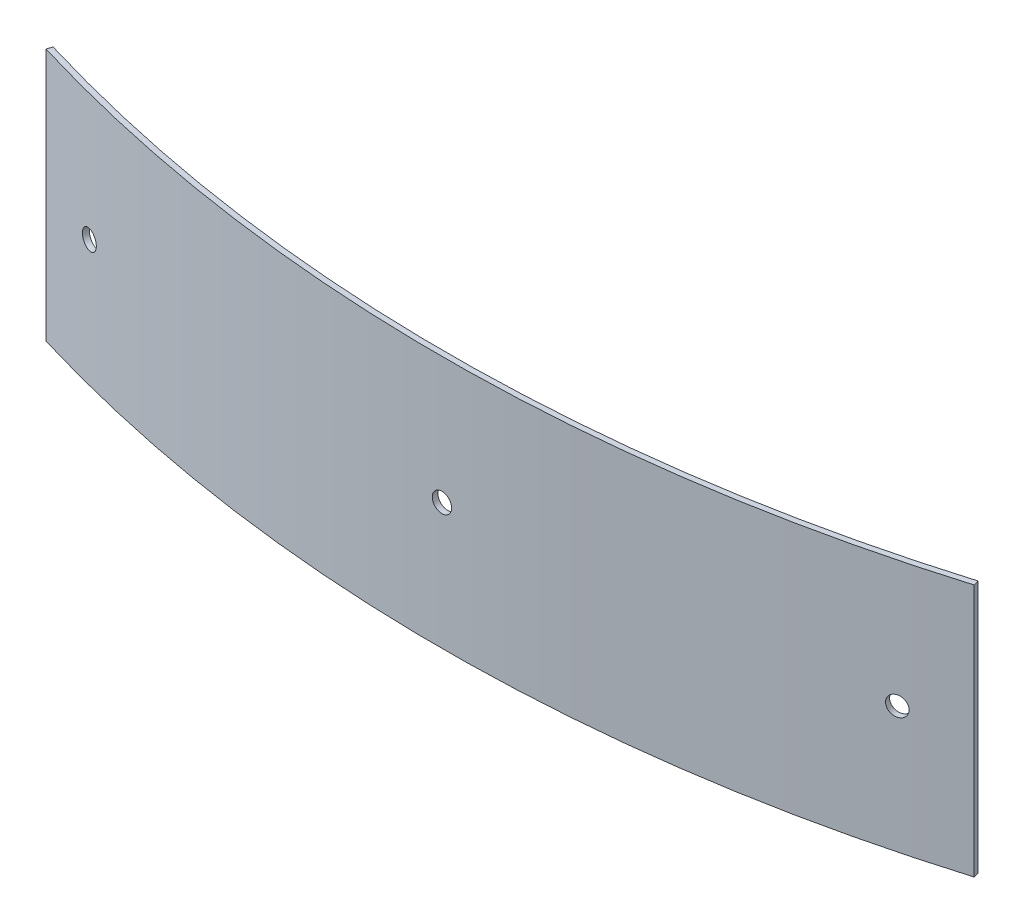
ISO-10303-21;
HEADER;
FILE_DESCRIPTION(('STEP AP214'),'2;1');
FILE_NAME('part.step','',(''),(''),'','','');
FILE_SCHEMA(('AUTOMOTIVE_DESIGN { 1 0 10303 214 1 1 1 1 }'));
ENDSEC;
DATA;
#1=APPLICATION_CONTEXT('core data for automotive mechanical design processes');
#2=APPLICATION_PROTOCOL_DEFINITION('international standard','automotive_design',2000,#1);
#3=PRODUCT_CONTEXT('',#1,'mechanical');
#4=PRODUCT('Part','Part','',(#3));
#5=PRODUCT_RELATED_PRODUCT_CATEGORY('part','',(#4));
#6=PRODUCT_DEFINITION_FORMATION('','',#4);
#7=PRODUCT_DEFINITION_CONTEXT('part definition',#1,'design');
#8=PRODUCT_DEFINITION('design','',#6,#7);
#9=PRODUCT_DEFINITION_SHAPE('','',#8);
#10=(LENGTH_UNIT() NAMED_UNIT(*) SI_UNIT(.MILLI.,.METRE.));
#11=(NAMED_UNIT(*) PLANE_ANGLE_UNIT() SI_UNIT($,.RADIAN.));
#12=(NAMED_UNIT(*) SI_UNIT($,.STERADIAN.) SOLID_ANGLE_UNIT());
#13=UNCERTAINTY_MEASURE_WITH_UNIT(LENGTH_MEASURE(1.E-05),#10,'distance_accuracy_value','');
#14=(GEOMETRIC_REPRESENTATION_CONTEXT(3) GLOBAL_UNCERTAINTY_ASSIGNED_CONTEXT((#13)) GLOBAL_UNIT_ASSIGNED_CONTEXT((#10,
#11,#12)) REPRESENTATION_CONTEXT('',''));
#15=CARTESIAN_POINT('',(0.,0.,0.));
#16=DIRECTION('',(0.,0.,1.));
#17=DIRECTION('',(1.,0.,0.));
#18=AXIS2_PLACEMENT_3D('',#15,#16,#17);
#19=CARTESIAN_POINT('',(0.,39.878,-237.572238635431));
#20=DIRECTION('',(0.,-1.,0.));
#21=DIRECTION('',(0.,0.,-1.));
#22=AXIS2_PLACEMENT_3D('',#19,#20,#21);
#23=CYLINDRICAL_SURFACE('',#22,253.492);
#24=DIRECTION('',(0.,-1.,0.));
#25=VECTOR('',#24,1.);
#26=CARTESIAN_POINT('',(72.9153494369118,39.878,5.20656167566136));
#27=LINE('',#26,#25);
#28=CARTESIAN_POINT('',(72.9153494369118,0.,5.20656167566136));
#29=VERTEX_POINT('',#28);
#30=CARTESIAN_POINT('',(72.9153494369118,39.878,5.20656167566136));
#31=VERTEX_POINT('',#30);
#32=EDGE_CURVE('E174',#29,#31,#27,.F.);
#33=ORIENTED_EDGE('',*,*,#32,.F.);
#34=CARTESIAN_POINT('',(0.,0.,-237.572238635431));
#35=DIRECTION('',(0.,1.,0.));
#36=DIRECTION('',(0.,0.,-1.));
#37=AXIS2_PLACEMENT_3D('',#34,#35,#36);
#38=CIRCLE('',#37,253.492);
#39=CARTESIAN_POINT('',(-72.9153494369118,0.,5.20656167566129));
#40=VERTEX_POINT('',#39);
#41=EDGE_CURVE('E83',#40,#29,#38,.T.);
#42=ORIENTED_EDGE('',*,*,#41,.F.);
#43=DIRECTION('',(0.,-1.,0.));
#44=VECTOR('',#43,1.);
#45=CARTESIAN_POINT('',(-72.9153494369118,39.878,5.2065616756613));
#46=LINE('',#45,#44);
#47=CARTESIAN_POINT('',(-72.9153494369118,39.878,5.2065616756613));
#48=VERTEX_POINT('',#47);
#49=EDGE_CURVE('E169',#48,#40,#46,.T.);
#50=ORIENTED_EDGE('',*,*,#49,.F.);
#51=CARTESIAN_POINT('',(0.,39.878,-237.572238635431));
#52=DIRECTION('',(0.,1.,0.));
#53=DIRECTION('',(0.,0.,-1.));
#54=AXIS2_PLACEMENT_3D('',#51,#52,#53);
#55=CIRCLE('',#54,253.492);
#56=EDGE_CURVE('E44',#48,#31,#55,.T.);
#57=ORIENTED_EDGE('',*,*,#56,.T.);
#58=EDGE_LOOP('',(#33,#42,#50,#57));
#59=FACE_BOUND('',#58,.T.);
#60=CARTESIAN_POINT('',(61.9927239420261,19.939,8.22258686390276));
#61=CARTESIAN_POINT('',(61.9927276324017,19.8533970809297,8.22258597349928));
#62=CARTESIAN_POINT('',(61.9997410726376,19.7677321113787,8.22081738039947));
#63=CARTESIAN_POINT('',(62.0276208205093,19.5987614871853,8.21378317638302));
#64=CARTESIAN_POINT('',(62.0485037971088,19.5154587973909,8.2085133575505));
#65=CARTESIAN_POINT('',(62.103525365677,19.3536851411215,8.19461633429835));
#66=CARTESIAN_POINT('',(62.1376576200431,19.2752118853164,8.18599073506389));
#67=CARTESIAN_POINT('',(62.2181960158537,19.1253115636568,8.16561328312497));
#68=CARTESIAN_POINT('',(62.2645991075236,19.0538827530352,8.15386220721736));
#69=CARTESIAN_POINT('',(62.3683668540975,18.9200654140653,8.12754511857903));
#70=CARTESIAN_POINT('',(62.4257327791689,18.8576779347312,8.11297877966626));
#71=CARTESIAN_POINT('',(62.5497913954779,18.7437225660385,8.08142355628616));
#72=CARTESIAN_POINT('',(62.6164844530249,18.6921551018192,8.06443457667266));
#73=CARTESIAN_POINT('',(62.7572963259185,18.601307020066,8.02849648899903));
#74=CARTESIAN_POINT('',(62.831415059135,18.5620262666573,8.00954740261818));
#75=CARTESIAN_POINT('',(62.9849702773748,18.496866079362,7.97020954517161));
#76=CARTESIAN_POINT('',(63.0644067512782,18.4709866174529,7.94982077711643));
#77=CARTESIAN_POINT('',(63.2263385727789,18.4333637904878,7.90817027727855));
#78=CARTESIAN_POINT('',(63.3088338887046,18.4216202791079,7.88690855453433));
#79=CARTESIAN_POINT('',(63.4745406703869,18.4126022847582,7.84410978566991));
#80=CARTESIAN_POINT('',(63.5577521347898,18.4153277744439,7.82257274007012));
#81=CARTESIAN_POINT('',(63.7225284829729,18.4351702124634,7.77983629795129));
#82=CARTESIAN_POINT('',(63.804093387423,18.4522869800219,7.75863689719435));
#83=CARTESIAN_POINT('',(63.9632645829819,18.5004258243352,7.71718554778711));
#84=CARTESIAN_POINT('',(64.0408708697292,18.5314479164103,7.69693360018069));
#85=CARTESIAN_POINT('',(64.1899259961113,18.6065169897973,7.65796628569981));
#86=CARTESIAN_POINT('',(64.261374797254,18.650564052524,7.639250928431));
#87=CARTESIAN_POINT('',(64.396091145886,18.7504326218042,7.60390695589148));
#88=CARTESIAN_POINT('',(64.4593586958025,18.8062541248643,7.58727834000163));
#89=CARTESIAN_POINT('',(64.5759231023959,18.9280880400755,7.55660067272227));
#90=CARTESIAN_POINT('',(64.6292197999315,18.994100614852,7.54255166250498));
#91=CARTESIAN_POINT('',(64.7243337789359,19.1344422062639,7.5174533314602));
#92=CARTESIAN_POINT('',(64.7661510588925,19.2087712239949,7.50640401102788));
#93=CARTESIAN_POINT('',(64.8371239029614,19.3636357991821,7.48763727706069));
#94=CARTESIAN_POINT('',(64.866279462919,19.4441713586749,7.47991986461913));
#95=CARTESIAN_POINT('',(64.9111047543138,19.6091628109455,7.46805006376299));
#96=CARTESIAN_POINT('',(64.926774487808,19.6936187031253,7.46389767480463));
#97=CARTESIAN_POINT('',(64.9441851619689,19.8640519545669,7.45928374611713));
#98=CARTESIAN_POINT('',(64.9459263207558,19.9500292899819,7.45882214859053));
#99=CARTESIAN_POINT('',(64.9354312180553,20.1210660345827,7.46160364940372));
#100=CARTESIAN_POINT('',(64.923194956613,20.2061254437714,7.46484674773154));
#101=CARTESIAN_POINT('',(64.8850909363888,20.3729111239842,7.4749393173368));
#102=CARTESIAN_POINT('',(64.8592232757993,20.4546374190135,7.48178876263628));
#103=CARTESIAN_POINT('',(64.7945876036131,20.6124376301216,7.4988869432243));
#104=CARTESIAN_POINT('',(64.7558195925888,20.6885115464512,7.50913567836201));
#105=CARTESIAN_POINT('',(64.6664786170075,20.8328485297034,7.53272405145869));
#106=CARTESIAN_POINT('',(64.6159055067633,20.9011115002153,7.54606372756308));
#107=CARTESIAN_POINT('',(64.5043848162451,21.0278878678244,7.57543465449422));
#108=CARTESIAN_POINT('',(64.4434372308788,21.0864012601359,7.59146590664215));
#109=CARTESIAN_POINT('',(64.3128912683034,21.1920181838726,7.62574387340233));
#110=CARTESIAN_POINT('',(64.2432927782106,21.2391215663872,7.64399061692402));
#111=CARTESIAN_POINT('',(64.0974162969539,21.3205802855769,7.68216186499263));
#112=CARTESIAN_POINT('',(64.0211383131638,21.3549356363248,7.70208636768742));
#113=CARTESIAN_POINT('',(63.8640646076165,21.4099228486588,7.74303177691758));
#114=CARTESIAN_POINT('',(63.7832689186839,21.4305548099422,7.76405267548668));
#115=CARTESIAN_POINT('',(63.6194501686322,21.4575099170932,7.80658437677812));
#116=CARTESIAN_POINT('',(63.536427103739,21.4638330387145,7.82809518033054));
#117=CARTESIAN_POINT('',(63.3705112711012,21.4619908943526,7.87099249422387));
#118=CARTESIAN_POINT('',(63.2876185010819,21.4538258841647,7.89237900675251));
#119=CARTESIAN_POINT('',(63.1243157479922,21.4232397348885,7.93442509779217));
#120=CARTESIAN_POINT('',(63.0439057699124,21.4008185671464,7.95508467484202));
#121=CARTESIAN_POINT('',(62.8878526658177,21.3423561074546,7.99510150858964));
#122=CARTESIAN_POINT('',(62.8122096284681,21.3063145622528,8.01445874106424));
#123=CARTESIAN_POINT('',(62.6678463017629,21.2216360037557,8.05133649848278));
#124=CARTESIAN_POINT('',(62.5991257415931,21.1729994834542,8.06885709527881));
#125=CARTESIAN_POINT('',(62.4705655049819,21.0645165013469,8.10158357090452));
#126=CARTESIAN_POINT('',(62.4107250399382,21.0046710360274,8.11678965527896));
#127=CARTESIAN_POINT('',(62.3016074925582,20.8754465854153,8.14448229776699));
#128=CARTESIAN_POINT('',(62.2523330390394,20.8060652346297,8.15696817910801));
#129=CARTESIAN_POINT('',(62.1657508564969,20.6597258303856,8.1788864614616));
#130=CARTESIAN_POINT('',(62.1284489347519,20.5827641236552,8.1883173806847));
#131=CARTESIAN_POINT('',(62.066941981976,20.4235338397184,8.20385823517227));
#132=CARTESIAN_POINT('',(62.0427212534932,20.3412717563157,8.20997215088625));
#133=CARTESIAN_POINT('',(62.0145212627474,20.2052379974593,8.21708849692003));
#134=CARTESIAN_POINT('',(62.0063575107593,20.152350202,8.2191479597556));
#135=CARTESIAN_POINT('',(61.9954576971487,20.0459830177239,8.22189742149953));
#136=CARTESIAN_POINT('',(61.9927216354635,19.992503628914,8.22258742042371));
#137=CARTESIAN_POINT('',(61.9927239420261,19.939,8.22258686390276));
#138=B_SPLINE_CURVE_WITH_KNOTS('',3,(#60,#61,#62,#63,#64,#65,#66,#67,#68,#69,#70,#71,#72,#73,
#74,#75,#76,#77,#78,#79,#80,#81,#82,#83,#84,#85,#86,#87,#88,#89,#90,#91,#92,#93,#94,#95,#96,#97,
#98,#99,#100,#101,#102,#103,#104,#105,#106,#107,#108,#109,#110,#111,#112,#113,#114,#115,#116,
#117,#118,#119,#120,#121,#122,#123,#124,#125,#126,#127,#128,#129,#130,#131,#132,#133,#134,#135,
#136,#137),.UNSPECIFIED.,.T.,.F.,(4,2,2,2,2,2,2,2,2,2,2,2,2,2,2,2,2,2,2,2,2,2,2,2,2,2,2,2,2,2,2,
2,2,2,2,2,2,2,4),(0.,0.256613468823956,0.51353590542239,0.770335597983319,1.02707152584284,
1.28383721749755,1.54061299608302,1.79738593496712,2.0541583369255,2.31092808096159,
2.56769733973801,2.82446337316719,3.08122968948818,3.33799761080639,3.59476545594184,
3.85153739890707,4.10830937569838,4.36508143674384,4.62185345862301,4.87862145946728,
5.13538945948109,5.39215560991691,5.64892174895959,5.90569105693094,6.16246049093966,
6.41923327583198,6.67600577726528,6.93277641328201,7.18954748439258,7.44631402212497,
7.70308107593971,7.95985290421537,8.21661468341948,8.47335364707543,8.73015641330902,
8.98708355418411,9.243701693165,9.40409052240337,9.5644793497869),.UNSPECIFIED.);
#139=CARTESIAN_POINT('',(61.9927239420261,19.939,8.22258686390276));
#140=VERTEX_POINT('',#139);
#141=EDGE_CURVE('E146',#140,#140,#138,.T.);
#142=ORIENTED_EDGE('',*,*,#141,.T.);
#143=EDGE_LOOP('',(#142));
#144=FACE_BOUND('',#143,.T.);
#145=CARTESIAN_POINT('',(-61.9927239420261,19.939,8.22258686390276));
#146=CARTESIAN_POINT('',(-61.9927276324017,19.8533970809297,8.22258597349928));
#147=CARTESIAN_POINT('',(-61.9997410726376,19.7677321113787,8.22081738039947));
#148=CARTESIAN_POINT('',(-62.0276208205093,19.5987614871853,8.21378317638302));
#149=CARTESIAN_POINT('',(-62.0485037971088,19.5154587973909,8.2085133575505));
#150=CARTESIAN_POINT('',(-62.103525365677,19.3536851411215,8.19461633429835));
#151=CARTESIAN_POINT('',(-62.1376576200431,19.2752118853164,8.18599073506389));
#152=CARTESIAN_POINT('',(-62.2181960158537,19.1253115636568,8.16561328312497));
#153=CARTESIAN_POINT('',(-62.2645991075236,19.0538827530352,8.15386220721736));
#154=CARTESIAN_POINT('',(-62.3683668540975,18.9200654140653,8.12754511857903));
#155=CARTESIAN_POINT('',(-62.4257327791689,18.8576779347312,8.11297877966626));
#156=CARTESIAN_POINT('',(-62.5497913954779,18.7437225660385,8.08142355628616));
#157=CARTESIAN_POINT('',(-62.6164844530249,18.6921551018192,8.06443457667266));
#158=CARTESIAN_POINT('',(-62.7572963259185,18.601307020066,8.02849648899903));
#159=CARTESIAN_POINT('',(-62.831415059135,18.5620262666573,8.00954740261818));
#160=CARTESIAN_POINT('',(-62.9849702773748,18.496866079362,7.97020954517161));
#161=CARTESIAN_POINT('',(-63.0644067512782,18.4709866174529,7.94982077711643));
#162=CARTESIAN_POINT('',(-63.2263385727789,18.4333637904878,7.90817027727855));
#163=CARTESIAN_POINT('',(-63.3088338887046,18.4216202791079,7.88690855453433));
#164=CARTESIAN_POINT('',(-63.4745406703869,18.4126022847582,7.84410978566991));
#165=CARTESIAN_POINT('',(-63.5577521347898,18.4153277744439,7.82257274007012));
#166=CARTESIAN_POINT('',(-63.7225284829729,18.4351702124634,7.77983629795129));
#167=CARTESIAN_POINT('',(-63.804093387423,18.4522869800219,7.75863689719435));
#168=CARTESIAN_POINT('',(-63.9632645829819,18.5004258243352,7.71718554778711));
#169=CARTESIAN_POINT('',(-64.0408708697292,18.5314479164103,7.69693360018069));
#170=CARTESIAN_POINT('',(-64.1899259961113,18.6065169897973,7.65796628569981));
#171=CARTESIAN_POINT('',(-64.261374797254,18.650564052524,7.639250928431));
#172=CARTESIAN_POINT('',(-64.396091145886,18.7504326218042,7.60390695589148));
#173=CARTESIAN_POINT('',(-64.4593586958025,18.8062541248643,7.58727834000163));
#174=CARTESIAN_POINT('',(-64.5759231023959,18.9280880400755,7.55660067272227));
#175=CARTESIAN_POINT('',(-64.6292197999315,18.994100614852,7.54255166250498));
#176=CARTESIAN_POINT('',(-64.7243337789359,19.1344422062639,7.5174533314602));
#177=CARTESIAN_POINT('',(-64.7661510588925,19.2087712239949,7.50640401102788));
#178=CARTESIAN_POINT('',(-64.8371239029614,19.3636357991821,7.48763727706069));
#179=CARTESIAN_POINT('',(-64.866279462919,19.4441713586749,7.47991986461913));
#180=CARTESIAN_POINT('',(-64.9111047543138,19.6091628109455,7.46805006376299));
#181=CARTESIAN_POINT('',(-64.926774487808,19.6936187031253,7.46389767480463));
#182=CARTESIAN_POINT('',(-64.9441851619689,19.8640519545669,7.45928374611713));
#183=CARTESIAN_POINT('',(-64.9459263207558,19.9500292899819,7.45882214859053));
#184=CARTESIAN_POINT('',(-64.9354312180553,20.1210660345827,7.46160364940372));
#185=CARTESIAN_POINT('',(-64.923194956613,20.2061254437714,7.46484674773154));
#186=CARTESIAN_POINT('',(-64.8850909363888,20.3729111239842,7.4749393173368));
#187=CARTESIAN_POINT('',(-64.8592232757993,20.4546374190135,7.48178876263628));
#188=CARTESIAN_POINT('',(-64.7945876036131,20.6124376301216,7.4988869432243));
#189=CARTESIAN_POINT('',(-64.7558195925888,20.6885115464512,7.50913567836201));
#190=CARTESIAN_POINT('',(-64.6664786170075,20.8328485297034,7.53272405145869));
#191=CARTESIAN_POINT('',(-64.6159055067633,20.9011115002153,7.54606372756308));
#192=CARTESIAN_POINT('',(-64.5043848162451,21.0278878678244,7.57543465449422));
#193=CARTESIAN_POINT('',(-64.4434372308788,21.0864012601359,7.59146590664215));
#194=CARTESIAN_POINT('',(-64.3128912683034,21.1920181838726,7.62574387340233));
#195=CARTESIAN_POINT('',(-64.2432927782106,21.2391215663872,7.64399061692402));
#196=CARTESIAN_POINT('',(-64.0974162969539,21.3205802855769,7.68216186499263));
#197=CARTESIAN_POINT('',(-64.0211383131638,21.3549356363248,7.70208636768742));
#198=CARTESIAN_POINT('',(-63.8640646076165,21.4099228486588,7.74303177691758));
#199=CARTESIAN_POINT('',(-63.7832689186839,21.4305548099422,7.76405267548668));
#200=CARTESIAN_POINT('',(-63.6194501686322,21.4575099170932,7.80658437677812));
#201=CARTESIAN_POINT('',(-63.536427103739,21.4638330387145,7.82809518033054));
#202=CARTESIAN_POINT('',(-63.3705112711012,21.4619908943526,7.87099249422387));
#203=CARTESIAN_POINT('',(-63.2876185010819,21.4538258841647,7.89237900675251));
#204=CARTESIAN_POINT('',(-63.1243157479922,21.4232397348885,7.93442509779217));
#205=CARTESIAN_POINT('',(-63.0439057699124,21.4008185671464,7.95508467484202));
#206=CARTESIAN_POINT('',(-62.8878526658177,21.3423561074546,7.99510150858964));
#207=CARTESIAN_POINT('',(-62.8122096284681,21.3063145622528,8.01445874106424));
#208=CARTESIAN_POINT('',(-62.6678463017629,21.2216360037557,8.05133649848278));
#209=CARTESIAN_POINT('',(-62.5991257415931,21.1729994834542,8.06885709527881));
#210=CARTESIAN_POINT('',(-62.4705655049819,21.0645165013469,8.10158357090452));
#211=CARTESIAN_POINT('',(-62.4107250399382,21.0046710360274,8.11678965527896));
#212=CARTESIAN_POINT('',(-62.3016074925582,20.8754465854153,8.14448229776699));
#213=CARTESIAN_POINT('',(-62.2523330390394,20.8060652346297,8.15696817910801));
#214=CARTESIAN_POINT('',(-62.1657508564969,20.6597258303856,8.1788864614616));
#215=CARTESIAN_POINT('',(-62.1284489347519,20.5827641236552,8.1883173806847));
#216=CARTESIAN_POINT('',(-62.066941981976,20.4235338397184,8.20385823517227));
#217=CARTESIAN_POINT('',(-62.0427212534932,20.3412717563157,8.20997215088625));
#218=CARTESIAN_POINT('',(-62.0145212627474,20.2052379974593,8.21708849692003));
#219=CARTESIAN_POINT('',(-62.0063575107593,20.152350202,8.2191479597556));
#220=CARTESIAN_POINT('',(-61.9954576971487,20.0459830177239,8.22189742149953));
#221=CARTESIAN_POINT('',(-61.9927216354635,19.992503628914,8.22258742042371));
#222=CARTESIAN_POINT('',(-61.9927239420261,19.939,8.22258686390276));
#223=B_SPLINE_CURVE_WITH_KNOTS('',3,(#145,#146,#147,#148,#149,#150,#151,#152,#153,#154,#155,
#156,#157,#158,#159,#160,#161,#162,#163,#164,#165,#166,#167,#168,#169,#170,#171,#172,#173,#174,
#175,#176,#177,#178,#179,#180,#181,#182,#183,#184,#185,#186,#187,#188,#189,#190,#191,#192,#193,
#194,#195,#196,#197,#198,#199,#200,#201,#202,#203,#204,#205,#206,#207,#208,#209,#210,#211,#212,
#213,#214,#215,#216,#217,#218,#219,#220,#221,#222),.UNSPECIFIED.,.T.,.F.,(4,2,2,2,2,2,2,2,2,2,2,
2,2,2,2,2,2,2,2,2,2,2,2,2,2,2,2,2,2,2,2,2,2,2,2,2,2,2,4),(0.,0.256613468823956,0.51353590542239,
0.770335597983319,1.02707152584284,1.28383721749755,1.54061299608302,1.79738593496712,
2.0541583369255,2.31092808096159,2.56769733973801,2.82446337316719,3.08122968948818,
3.33799761080639,3.59476545594184,3.85153739890707,4.10830937569838,4.36508143674384,
4.62185345862301,4.87862145946728,5.13538945948109,5.39215560991691,5.64892174895959,
5.90569105693094,6.16246049093966,6.41923327583198,6.67600577726528,6.93277641328201,
7.18954748439258,7.44631402212497,7.70308107593971,7.95985290421537,8.21661468341948,
8.47335364707543,8.73015641330902,8.98708355418411,9.243701693165,9.40409052240337,
9.5644793497869),.UNSPECIFIED.);
#224=CARTESIAN_POINT('',(-61.9927239420261,19.939,8.22258686390276));
#225=VERTEX_POINT('',#224);
#226=EDGE_CURVE('E141',#225,#225,#223,.T.);
#227=ORIENTED_EDGE('',*,*,#226,.F.);
#228=EDGE_LOOP('',(#227));
#229=FACE_BOUND('',#228,.T.);
#230=CARTESIAN_POINT('',(1.52399999999998,19.939,15.9151801608481));
#231=CARTESIAN_POINT('',(1.52399620423233,19.8533970809297,15.9151802228024));
#232=CARTESIAN_POINT('',(1.51676333826947,19.7677321113787,15.9152239887607));
#233=CARTESIAN_POINT('',(1.48801040212297,19.5987614871853,15.9153943721254));
#234=CARTESIAN_POINT('',(1.4664731403435,19.5154587973909,15.9155210892231));
#235=CARTESIAN_POINT('',(1.409724601826,19.3536851411215,15.9158430195145));
#236=CARTESIAN_POINT('',(1.37451986272939,19.2752118853164,15.9160381999553));
#237=CARTESIAN_POINT('',(1.2914446983665,19.1253115636568,15.9164750218133));
#238=CARTESIAN_POINT('',(1.24357742022665,19.0538827530352,15.9167166516819));
#239=CARTESIAN_POINT('',(1.13652564847379,18.9200654140653,15.917219193223));
#240=CARTESIAN_POINT('',(1.07733984348175,18.8576779347312,15.9174801071276));
#241=CARTESIAN_POINT('',(0.949331989875804,18.7437225660385,15.917991788925));
#242=CARTESIAN_POINT('',(0.880509562797522,18.6921551018192,15.9182425564188));
#243=CARTESIAN_POINT('',(0.735184701780915,18.601307020066,15.9187056589439));
#244=CARTESIAN_POINT('',(0.658682352784743,18.5620262666573,15.9189179944001));
#245=CARTESIAN_POINT('',(0.500168817671141,18.496866079362,15.9192802967012));
#246=CARTESIAN_POINT('',(0.418157643073314,18.4709866174529,15.9194302636764));
#247=CARTESIAN_POINT('',(0.250955279866942,18.4333637904878,15.9196509206617));
#248=CARTESIAN_POINT('',(0.165764124184391,18.4216202791079,15.9197216114924));
#249=CARTESIAN_POINT('',(-0.00538046141777373,18.4126022847582,15.9197757490747));
#250=CARTESIAN_POINT('',(-0.0913338898964887,18.4153277744439,15.9197591959911));
#251=CARTESIAN_POINT('',(-0.261562073131015,18.4351702124634,15.9196407131218));
#252=CARTESIAN_POINT('',(-0.345836848959533,18.4522869800219,15.9195387844084));
#253=CARTESIAN_POINT('',(-0.5103166553887,18.5004258243352,15.9192610428787));
#254=CARTESIAN_POINT('',(-0.590521681505407,18.5314479164103,15.919085229981));
#255=CARTESIAN_POINT('',(-0.74458568675621,18.6065169897973,15.9186795395623));
#256=CARTESIAN_POINT('',(-0.818444626219243,18.650564052524,15.9184496617034));
#257=CARTESIAN_POINT('',(-0.957719365255371,18.7504326218042,15.9179617580043));
#258=CARTESIAN_POINT('',(-1.02313516733353,18.8062541248643,15.9177037321725));
#259=CARTESIAN_POINT('',(-1.14366779698675,18.9280880400755,15.9171886175792));
#260=CARTESIAN_POINT('',(-1.19878446018094,18.994100614852,15.9169315288327));
#261=CARTESIAN_POINT('',(-1.2971529547498,19.1344422062639,15.916447277303));
#262=CARTESIAN_POINT('',(-1.34040478456146,19.2087712239949,15.9162201145238));
#263=CARTESIAN_POINT('',(-1.41381579100444,19.3636357991821,15.9158213263015));
#264=CARTESIAN_POINT('',(-1.44397496333969,19.4441713586749,15.9156497008767));
#265=CARTESIAN_POINT('',(-1.4903444242193,19.6091628109455,15.9153813378273));
#266=CARTESIAN_POINT('',(-1.50655471489134,19.6936187031253,15.9152846001912));
#267=CARTESIAN_POINT('',(-1.52456605348109,19.8640519545669,15.9151769206865));
#268=CARTESIAN_POINT('',(-1.52636732704274,19.9500292899819,15.9151659774745));
#269=CARTESIAN_POINT('',(-1.51551008594279,20.1210660345827,15.9152311170667));
#270=CARTESIAN_POINT('',(-1.50285157132795,20.2061254437714,15.9153071998708));
#271=CARTESIAN_POINT('',(-1.46343427644028,20.3729111239842,15.9155378125813));
#272=CARTESIAN_POINT('',(-1.43667559773661,20.4546374190135,15.9156923419226));
#273=CARTESIAN_POINT('',(-1.36981768170034,20.6124376301216,15.9160624252496));
#274=CARTESIAN_POINT('',(-1.32971844495969,20.6885115464512,15.9162779792326));
#275=CARTESIAN_POINT('',(-1.23731713331001,20.8328485297034,15.9167458131582));
#276=CARTESIAN_POINT('',(-1.18501490780342,20.9011115002153,15.9169980935541));
#277=CARTESIAN_POINT('',(-1.06969252162079,21.0278878678244,15.9175109362141));
#278=CARTESIAN_POINT('',(-1.00667235568377,21.0864012601359,15.9177714984823));
#279=CARTESIAN_POINT('',(-0.871702072599163,21.1920181838726,15.9182715324792));
#280=CARTESIAN_POINT('',(-0.799751838924956,21.2391215663872,15.9185110039327));
#281=CARTESIAN_POINT('',(-0.648964550563464,21.3205802855769,15.9189418537121));
#282=CARTESIAN_POINT('',(-0.570127503478831,21.3549356363248,15.9191332320912));
#283=CARTESIAN_POINT('',(-0.407805054358638,21.4099228486588,15.9194463183899));
#284=CARTESIAN_POINT('',(-0.324319686096891,21.4305548099422,15.9195680268156));
#285=CARTESIAN_POINT('',(-0.155069862242828,21.4575099170932,15.9197280537601));
#286=CARTESIAN_POINT('',(-0.0693054027888723,21.4638330387145,15.9197663721374));
#287=CARTESIAN_POINT('',(0.102066248707363,21.4619908943526,15.9197552985132));
#288=CARTESIAN_POINT('',(0.187673443499517,21.4538258841647,15.9197059080603));
#289=CARTESIAN_POINT('',(0.356302119015522,21.4232397348885,15.9195249879067));
#290=CARTESIAN_POINT('',(0.439323594541928,21.4008185671464,15.9193934580411));
#291=CARTESIAN_POINT('',(0.600425454040813,21.3423561074546,15.9190630843733));
#292=CARTESIAN_POINT('',(0.678505746107347,21.3063145622528,15.9188642393196));
#293=CARTESIAN_POINT('',(0.827504213266131,21.2216360037557,15.918421662821));
#294=CARTESIAN_POINT('',(0.898422668536774,21.1729994834542,15.9181779331332));
#295=CARTESIAN_POINT('',(1.03108201335826,21.0645165013469,15.9176730807241));
#296=CARTESIAN_POINT('',(1.09282371785677,21.0046710360274,15.9174119595504));
#297=CARTESIAN_POINT('',(1.20539929781494,20.8754465854153,15.9169016740756));
#298=CARTESIAN_POINT('',(1.2562304587409,20.8060652346297,15.9166525127621));
#299=CARTESIAN_POINT('',(1.34554269409276,20.6597258303856,15.9161941988879));
#300=CARTESIAN_POINT('',(1.3840177752051,20.5827641236552,15.9159850657625));
#301=CARTESIAN_POINT('',(1.44745670561147,20.4235338397184,15.9156307962788));
#302=CARTESIAN_POINT('',(1.47243674898164,20.3412717563157,15.915485583255));
#303=CARTESIAN_POINT('',(1.50152029422968,20.2052379974593,15.9153145430784));
#304=CARTESIAN_POINT('',(1.5099396597667,20.152350202,15.9152643669072));
#305=CARTESIAN_POINT('',(1.52118069883688,20.0459830177239,15.9151971564309));
#306=CARTESIAN_POINT('',(1.52400237243477,19.992503628914,15.9151801221254));
#307=CARTESIAN_POINT('',(1.52399999999998,19.939,15.9151801608481));
#308=B_SPLINE_CURVE_WITH_KNOTS('',3,(#230,#231,#232,#233,#234,#235,#236,#237,#238,#239,#240,
#241,#242,#243,#244,#245,#246,#247,#248,#249,#250,#251,#252,#253,#254,#255,#256,#257,#258,#259,
#260,#261,#262,#263,#264,#265,#266,#267,#268,#269,#270,#271,#272,#273,#274,#275,#276,#277,#278,
#279,#280,#281,#282,#283,#284,#285,#286,#287,#288,#289,#290,#291,#292,#293,#294,#295,#296,#297,
#298,#299,#300,#301,#302,#303,#304,#305,#306,#307),.UNSPECIFIED.,.T.,.F.,(4,2,2,2,2,2,2,2,2,2,2,
2,2,2,2,2,2,2,2,2,2,2,2,2,2,2,2,2,2,2,2,2,2,2,2,2,2,2,4),(0.,0.256613468823956,0.51353590542239,
0.770335597983319,1.02707152584284,1.28383721749755,1.54061299608302,1.79738593496711,
2.0541583369255,2.31092808096159,2.56769733973801,2.82446337316719,3.08122968948818,
3.33799761080639,3.59476545594184,3.85153739890706,4.10830937569838,4.36508143674384,
4.62185345862301,4.87862145946728,5.13538945948109,5.39215560991691,5.64892174895959,
5.90569105693093,6.16246049093966,6.41923327583199,6.67600577726528,6.93277641328201,
7.18954748439258,7.44631402212497,7.70308107593971,7.95985290421537,8.21661468341949,
8.47335364707544,8.73015641330902,8.98708355418412,9.243701693165,9.40409052240337,
9.5644793497869),.UNSPECIFIED.);
#309=CARTESIAN_POINT('',(1.52399999999998,19.939,15.9151801608481));
#310=VERTEX_POINT('',#309);
#311=EDGE_CURVE('E99',#310,#310,#308,.T.);
#312=ORIENTED_EDGE('',*,*,#311,.F.);
#313=EDGE_LOOP('',(#312));
#314=FACE_BOUND('',#313,.T.);
#315=ADVANCED_FACE('F32',(#59,#144,#229,#314),#23,.F.);
#316=CARTESIAN_POINT('',(0.,39.878,-237.572238635431));
#317=DIRECTION('',(0.,-1.,0.));
#318=DIRECTION('',(0.,0.,-1.));
#319=AXIS2_PLACEMENT_3D('',#316,#317,#318);
#320=CYLINDRICAL_SURFACE('',#319,254.381);
#321=CARTESIAN_POINT('',(62.2153157743359,19.939,9.08328561671268));
#322=CARTESIAN_POINT('',(62.2153194646592,20.0246029248611,9.08328472609912));
#323=CARTESIAN_POINT('',(62.2223328675429,20.1102679003445,9.081515984676));
#324=CARTESIAN_POINT('',(62.2502124702939,20.2792385366365,9.07448120315445));
#325=CARTESIAN_POINT('',(62.2710953390756,20.3625412325908,9.06921095479323));
#326=CARTESIAN_POINT('',(62.3261166345618,20.5243149012112,9.0553128400932));
#327=CARTESIAN_POINT('',(62.3602487237341,20.6027881631922,9.04668657903981));
#328=CARTESIAN_POINT('',(62.4407867509998,20.7526884959777,9.02630764562421));
#329=CARTESIAN_POINT('',(62.4871896393126,20.8241173115588,9.01455575010206));
#330=CARTESIAN_POINT('',(62.5909569602381,20.9579346529377,8.98823695750806));
#331=CARTESIAN_POINT('',(62.6483226621534,21.020322130434,8.97366973446818));
#332=CARTESIAN_POINT('',(62.7723808407174,21.1342774941223,8.94211277723668));
#333=CARTESIAN_POINT('',(62.8390736836744,21.1858449551766,8.92512294790058));
#334=CARTESIAN_POINT('',(62.9798851561776,21.2766930267752,8.88918329204627));
#335=CARTESIAN_POINT('',(63.0540037032011,21.3159737738429,8.87023348730938));
#336=CARTESIAN_POINT('',(63.207558601564,21.3811339489399,8.83089440470525));
#337=CARTESIAN_POINT('',(63.2869949417862,21.4070134049844,8.81050512984731));
#338=CARTESIAN_POINT('',(63.4489265705066,21.4446362230101,8.76885388329951));
#339=CARTESIAN_POINT('',(63.5314218275939,21.4563797301061,8.74759192057069));
#340=CARTESIAN_POINT('',(63.6971285670277,21.4653977150684,8.70479296715228));
#341=CARTESIAN_POINT('',(63.7803400480207,21.4626722202703,8.68325597698235));
#342=CARTESIAN_POINT('',(63.9451165110295,21.4428297703509,8.64051993278739));
#343=CARTESIAN_POINT('',(64.0266815135658,21.4257129947064,8.61932087455129));
#344=CARTESIAN_POINT('',(64.1858529686271,21.3775741307638,8.57787046049907));
#345=CARTESIAN_POINT('',(64.2634594167918,21.3465520271501,8.5576191057268));
#346=CARTESIAN_POINT('',(64.41251490769,21.2714829290592,8.51865316130513));
#347=CARTESIAN_POINT('',(64.4839639122141,21.2274358537647,8.49993858119204));
#348=CARTESIAN_POINT('',(64.6186806896241,21.1275672576481,8.46459625889679));
#349=CARTESIAN_POINT('',(64.6819484649435,21.0717457403283,8.4479685160939));
#350=CARTESIAN_POINT('',(64.7985133116089,20.9499118026544,8.41729259444209));
#351=CARTESIAN_POINT('',(64.8518102249145,20.8838992207999,8.40324445648054));
#352=CARTESIAN_POINT('',(64.9469246080751,20.7435576175254,8.37814776903133));
#353=CARTESIAN_POINT('',(64.988742076418,20.66922859501,8.3670992199388));
#354=CARTESIAN_POINT('',(65.0597152478776,20.5143640133172,8.34833384096386));
#355=CARTESIAN_POINT('',(65.0888709468726,20.4338284521195,8.34061701216604));
#356=CARTESIAN_POINT('',(65.133696451031,20.2688369992876,8.32874812516355));
#357=CARTESIAN_POINT('',(65.1493662582414,20.1843811082485,8.32459606641781));
#358=CARTESIAN_POINT('',(65.1667770066277,20.01394785203,8.31998250736866));
#359=CARTESIAN_POINT('',(65.1685181644032,19.927970510531,8.31952094967557));
#360=CARTESIAN_POINT('',(65.1580229817321,19.7569337555737,8.32230223617152));
#361=CARTESIAN_POINT('',(65.1457866413261,19.6718743421127,8.32554508034983));
#362=CARTESIAN_POINT('',(65.1076823918261,19.505088650927,8.33563687693339));
#363=CARTESIAN_POINT('',(65.0818145802358,19.4233623493656,8.34248580354493));
#364=CARTESIAN_POINT('',(65.0171785496983,19.2655621281348,8.35958274104101));
#365=CARTESIAN_POINT('',(64.9784103313313,19.1894882082112,8.36983075177268));
#366=CARTESIAN_POINT('',(64.8890689104477,19.0451512280858,8.39341755136632));
#367=CARTESIAN_POINT('',(64.8384955632713,18.9768882636147,8.4067563781031));
#368=CARTESIAN_POINT('',(64.7269743921121,18.8501119114102,8.43612557812664));
#369=CARTESIAN_POINT('',(64.6660265630431,18.7915985284566,8.45215595273294));
#370=CARTESIAN_POINT('',(64.5354801389558,18.6859816317464,8.48643223378676));
#371=CARTESIAN_POINT('',(64.4658814318219,18.638878265887,8.50467816894792));
#372=CARTESIAN_POINT('',(64.3200045623315,18.5574195809435,8.54284796201714));
#373=CARTESIAN_POINT('',(64.2437264073466,18.5230642477908,8.56277181807344));
#374=CARTESIAN_POINT('',(64.086652420526,18.4680770692892,8.60371616970623));
#375=CARTESIAN_POINT('',(64.0058566212975,18.4474451249026,8.62473665736747));
#376=CARTESIAN_POINT('',(63.8420377269332,18.4204900518682,8.66726781812187));
#377=CARTESIAN_POINT('',(63.7590146280218,18.4141669474774,8.68877849204594));
#378=CARTESIAN_POINT('',(63.5930987976947,18.4160091260866,8.73167584510261));
#379=CARTESIAN_POINT('',(63.5102060640172,18.4241741548834,8.75306252640414));
#380=CARTESIAN_POINT('',(63.3469034583966,18.4547603439164,8.79510923214578));
#381=CARTESIAN_POINT('',(63.2664935914442,18.4771815328065,8.81576925512527));
#382=CARTESIAN_POINT('',(63.1104407718142,18.5356440370837,8.85578720764192));
#383=CARTESIAN_POINT('',(63.034797907804,18.5716856057259,8.87514511295984));
#384=CARTESIAN_POINT('',(62.8904349712601,18.6563642128454,8.91202436687896));
#385=CARTESIAN_POINT('',(62.8217146279045,18.7050007583179,8.92954578732795));
#386=CARTESIAN_POINT('',(62.6931548523341,18.8134837854429,8.9622739660329));
#387=CARTESIAN_POINT('',(62.6333146305388,18.8733292693752,8.97748093008301));
#388=CARTESIAN_POINT('',(62.5241975624265,19.0025537544201,9.00517529068711));
#389=CARTESIAN_POINT('',(62.4749233449281,19.0719351210277,9.0176620104575));
#390=CARTESIAN_POINT('',(62.3883416043812,19.2182745494764,9.03958183308036));
#391=CARTESIAN_POINT('',(62.3510398880259,19.2952362642292,9.04901345422269));
#392=CARTESIAN_POINT('',(62.2895332907564,19.454466559019,9.06455549585866));
#393=CARTESIAN_POINT('',(62.2653127124332,19.5367286452488,9.07066989706729));
#394=CARTESIAN_POINT('',(62.2371129217041,19.6727623406161,9.07778680910847));
#395=CARTESIAN_POINT('',(62.2289492344837,19.7256500699142,9.07984643645406));
#396=CARTESIAN_POINT('',(62.2180495075674,19.8320171194481,9.08259611857405));
#397=CARTESIAN_POINT('',(62.2153134678092,19.8854964396771,9.08328617336417));
#398=CARTESIAN_POINT('',(62.2153157743359,19.939,9.08328561671268));
#399=B_SPLINE_CURVE_WITH_KNOTS('',3,(#321,#322,#323,#324,#325,#326,#327,#328,#329,#330,#331,
#332,#333,#334,#335,#336,#337,#338,#339,#340,#341,#342,#343,#344,#345,#346,#347,#348,#349,#350,
#351,#352,#353,#354,#355,#356,#357,#358,#359,#360,#361,#362,#363,#364,#365,#366,#367,#368,#369,
#370,#371,#372,#373,#374,#375,#376,#377,#378,#379,#380,#381,#382,#383,#384,#385,#386,#387,#388,
#389,#390,#391,#392,#393,#394,#395,#396,#397,#398),.UNSPECIFIED.,.T.,.F.,(4,2,2,2,2,2,2,2,2,2,2,
2,2,2,2,2,2,2,2,2,2,2,2,2,2,2,2,2,2,2,2,2,2,2,2,2,2,2,4),(0.,0.256613486448798,
0.513535941351612,0.770335653039562,1.02707159969426,1.28383728992203,1.54061306704106,
1.7973859909029,2.05415837798272,2.31092812910046,2.56769739511599,2.82446345895685,
3.08122980560697,3.3379977454744,3.59476560896542,3.85153754194024,4.10830950873924,
4.36508155912531,4.62185357053765,4.87862158897104,5.13538960666049,5.39215578775588,
5.6489219573035,5.90569127342512,6.16246071542991,6.41923348551939,6.67600597223631,
6.93277660588112,7.18954767481232,7.44631423858076,7.70308131843332,7.95985317280612,
8.21661497788276,8.47335393915528,8.73015670307298,8.98708382942797,9.24370195344728,
9.40409057722193,9.5644791991547),.UNSPECIFIED.);
#400=CARTESIAN_POINT('',(62.2153157743359,19.939,9.08328561671268));
#401=VERTEX_POINT('',#400);
#402=EDGE_CURVE('E134',#401,#401,#399,.T.);
#403=ORIENTED_EDGE('',*,*,#402,.T.);
#404=EDGE_LOOP('',(#403));
#405=FACE_BOUND('',#404,.T.);
#406=CARTESIAN_POINT('',(-62.2153157743359,19.939,9.08328561671268));
#407=CARTESIAN_POINT('',(-62.2153194646592,20.0246029248611,9.08328472609912));
#408=CARTESIAN_POINT('',(-62.2223328675429,20.1102679003445,9.081515984676));
#409=CARTESIAN_POINT('',(-62.2502124702939,20.2792385366365,9.07448120315445));
#410=CARTESIAN_POINT('',(-62.2710953390756,20.3625412325908,9.06921095479323));
#411=CARTESIAN_POINT('',(-62.3261166345618,20.5243149012112,9.0553128400932));
#412=CARTESIAN_POINT('',(-62.3602487237341,20.6027881631922,9.04668657903981));
#413=CARTESIAN_POINT('',(-62.4407867509998,20.7526884959777,9.02630764562421));
#414=CARTESIAN_POINT('',(-62.4871896393126,20.8241173115588,9.01455575010206));
#415=CARTESIAN_POINT('',(-62.5909569602381,20.9579346529377,8.98823695750806));
#416=CARTESIAN_POINT('',(-62.6483226621534,21.020322130434,8.97366973446818));
#417=CARTESIAN_POINT('',(-62.7723808407174,21.1342774941223,8.94211277723668));
#418=CARTESIAN_POINT('',(-62.8390736836744,21.1858449551766,8.92512294790058));
#419=CARTESIAN_POINT('',(-62.9798851561776,21.2766930267752,8.88918329204627));
#420=CARTESIAN_POINT('',(-63.0540037032011,21.3159737738429,8.87023348730938));
#421=CARTESIAN_POINT('',(-63.207558601564,21.3811339489399,8.83089440470525));
#422=CARTESIAN_POINT('',(-63.2869949417862,21.4070134049844,8.81050512984731));
#423=CARTESIAN_POINT('',(-63.4489265705066,21.4446362230101,8.76885388329951));
#424=CARTESIAN_POINT('',(-63.5314218275939,21.4563797301061,8.74759192057069));
#425=CARTESIAN_POINT('',(-63.6971285670277,21.4653977150684,8.70479296715228));
#426=CARTESIAN_POINT('',(-63.7803400480207,21.4626722202703,8.68325597698235));
#427=CARTESIAN_POINT('',(-63.9451165110295,21.4428297703509,8.64051993278739));
#428=CARTESIAN_POINT('',(-64.0266815135658,21.4257129947064,8.61932087455129));
#429=CARTESIAN_POINT('',(-64.1858529686271,21.3775741307638,8.57787046049907));
#430=CARTESIAN_POINT('',(-64.2634594167918,21.3465520271501,8.5576191057268));
#431=CARTESIAN_POINT('',(-64.41251490769,21.2714829290592,8.51865316130513));
#432=CARTESIAN_POINT('',(-64.4839639122141,21.2274358537647,8.49993858119204));
#433=CARTESIAN_POINT('',(-64.6186806896241,21.1275672576481,8.46459625889679));
#434=CARTESIAN_POINT('',(-64.6819484649435,21.0717457403283,8.4479685160939));
#435=CARTESIAN_POINT('',(-64.7985133116089,20.9499118026544,8.41729259444209));
#436=CARTESIAN_POINT('',(-64.8518102249145,20.8838992207999,8.40324445648054));
#437=CARTESIAN_POINT('',(-64.9469246080751,20.7435576175254,8.37814776903133));
#438=CARTESIAN_POINT('',(-64.988742076418,20.66922859501,8.3670992199388));
#439=CARTESIAN_POINT('',(-65.0597152478776,20.5143640133172,8.34833384096386));
#440=CARTESIAN_POINT('',(-65.0888709468726,20.4338284521195,8.34061701216604));
#441=CARTESIAN_POINT('',(-65.133696451031,20.2688369992876,8.32874812516355));
#442=CARTESIAN_POINT('',(-65.1493662582414,20.1843811082485,8.32459606641781));
#443=CARTESIAN_POINT('',(-65.1667770066277,20.01394785203,8.31998250736866));
#444=CARTESIAN_POINT('',(-65.1685181644032,19.927970510531,8.31952094967557));
#445=CARTESIAN_POINT('',(-65.1580229817321,19.7569337555737,8.32230223617152));
#446=CARTESIAN_POINT('',(-65.1457866413261,19.6718743421127,8.32554508034983));
#447=CARTESIAN_POINT('',(-65.1076823918261,19.505088650927,8.33563687693339));
#448=CARTESIAN_POINT('',(-65.0818145802358,19.4233623493656,8.34248580354493));
#449=CARTESIAN_POINT('',(-65.0171785496983,19.2655621281348,8.35958274104101));
#450=CARTESIAN_POINT('',(-64.9784103313313,19.1894882082112,8.36983075177268));
#451=CARTESIAN_POINT('',(-64.8890689104477,19.0451512280858,8.39341755136632));
#452=CARTESIAN_POINT('',(-64.8384955632713,18.9768882636147,8.4067563781031));
#453=CARTESIAN_POINT('',(-64.7269743921121,18.8501119114102,8.43612557812664));
#454=CARTESIAN_POINT('',(-64.6660265630431,18.7915985284566,8.45215595273294));
#455=CARTESIAN_POINT('',(-64.5354801389558,18.6859816317464,8.48643223378676));
#456=CARTESIAN_POINT('',(-64.4658814318219,18.638878265887,8.50467816894792));
#457=CARTESIAN_POINT('',(-64.3200045623315,18.5574195809435,8.54284796201714));
#458=CARTESIAN_POINT('',(-64.2437264073466,18.5230642477908,8.56277181807344));
#459=CARTESIAN_POINT('',(-64.086652420526,18.4680770692892,8.60371616970623));
#460=CARTESIAN_POINT('',(-64.0058566212975,18.4474451249026,8.62473665736747));
#461=CARTESIAN_POINT('',(-63.8420377269332,18.4204900518682,8.66726781812187));
#462=CARTESIAN_POINT('',(-63.7590146280218,18.4141669474774,8.68877849204594));
#463=CARTESIAN_POINT('',(-63.5930987976947,18.4160091260866,8.73167584510261));
#464=CARTESIAN_POINT('',(-63.5102060640172,18.4241741548834,8.75306252640414));
#465=CARTESIAN_POINT('',(-63.3469034583966,18.4547603439164,8.79510923214578));
#466=CARTESIAN_POINT('',(-63.2664935914442,18.4771815328065,8.81576925512527));
#467=CARTESIAN_POINT('',(-63.1104407718142,18.5356440370837,8.85578720764192));
#468=CARTESIAN_POINT('',(-63.034797907804,18.5716856057259,8.87514511295984));
#469=CARTESIAN_POINT('',(-62.8904349712601,18.6563642128454,8.91202436687896));
#470=CARTESIAN_POINT('',(-62.8217146279045,18.7050007583179,8.92954578732795));
#471=CARTESIAN_POINT('',(-62.6931548523341,18.8134837854429,8.9622739660329));
#472=CARTESIAN_POINT('',(-62.6333146305388,18.8733292693752,8.97748093008301));
#473=CARTESIAN_POINT('',(-62.5241975624265,19.0025537544201,9.00517529068711));
#474=CARTESIAN_POINT('',(-62.4749233449281,19.0719351210277,9.0176620104575));
#475=CARTESIAN_POINT('',(-62.3883416043812,19.2182745494764,9.03958183308036));
#476=CARTESIAN_POINT('',(-62.3510398880259,19.2952362642292,9.04901345422269));
#477=CARTESIAN_POINT('',(-62.2895332907564,19.454466559019,9.06455549585866));
#478=CARTESIAN_POINT('',(-62.2653127124332,19.5367286452488,9.07066989706729));
#479=CARTESIAN_POINT('',(-62.2371129217041,19.6727623406161,9.07778680910847));
#480=CARTESIAN_POINT('',(-62.2289492344837,19.7256500699142,9.07984643645406));
#481=CARTESIAN_POINT('',(-62.2180495075674,19.8320171194481,9.08259611857405));
#482=CARTESIAN_POINT('',(-62.2153134678092,19.8854964396771,9.08328617336417));
#483=CARTESIAN_POINT('',(-62.2153157743359,19.939,9.08328561671268));
#484=B_SPLINE_CURVE_WITH_KNOTS('',3,(#406,#407,#408,#409,#410,#411,#412,#413,#414,#415,#416,
#417,#418,#419,#420,#421,#422,#423,#424,#425,#426,#427,#428,#429,#430,#431,#432,#433,#434,#435,
#436,#437,#438,#439,#440,#441,#442,#443,#444,#445,#446,#447,#448,#449,#450,#451,#452,#453,#454,
#455,#456,#457,#458,#459,#460,#461,#462,#463,#464,#465,#466,#467,#468,#469,#470,#471,#472,#473,
#474,#475,#476,#477,#478,#479,#480,#481,#482,#483),.UNSPECIFIED.,.T.,.F.,(4,2,2,2,2,2,2,2,2,2,2,
2,2,2,2,2,2,2,2,2,2,2,2,2,2,2,2,2,2,2,2,2,2,2,2,2,2,2,4),(0.,0.256613486448798,
0.513535941351612,0.770335653039562,1.02707159969426,1.28383728992203,1.54061306704106,
1.7973859909029,2.05415837798272,2.31092812910046,2.56769739511599,2.82446345895685,
3.08122980560697,3.3379977454744,3.59476560896542,3.85153754194024,4.10830950873924,
4.36508155912531,4.62185357053765,4.87862158897104,5.13538960666049,5.39215578775588,
5.6489219573035,5.90569127342512,6.16246071542991,6.41923348551939,6.67600597223631,
6.93277660588112,7.18954767481232,7.44631423858076,7.70308131843332,7.95985317280612,
8.21661497788276,8.47335393915528,8.73015670307298,8.98708382942797,9.24370195344728,
9.40409057722193,9.5644791991547),.UNSPECIFIED.);
#485=CARTESIAN_POINT('',(-62.2153157743359,19.939,9.08328561671268));
#486=VERTEX_POINT('',#485);
#487=EDGE_CURVE('E104',#486,#486,#484,.T.);
#488=ORIENTED_EDGE('',*,*,#487,.F.);
#489=EDGE_LOOP('',(#488));
#490=FACE_BOUND('',#489,.T.);
#491=CARTESIAN_POINT('',(1.52399999999998,19.939,16.8041961713336));
#492=CARTESIAN_POINT('',(1.52399620423038,20.0246029248611,16.8041962330714));
#493=CARTESIAN_POINT('',(1.51676333729276,20.1102679003445,16.8042398460786));
#494=CARTESIAN_POINT('',(1.48801039704883,20.2792385366365,16.8044096339978));
#495=CARTESIAN_POINT('',(1.4664731321075,20.3625412325908,16.8045359082529));
#496=CARTESIAN_POINT('',(1.40972458469701,20.5243149012112,16.8048567134873));
#497=CARTESIAN_POINT('',(1.37451983982617,20.6027881631922,16.8050512118285));
#498=CARTESIAN_POINT('',(1.29144466133689,20.7526884959777,16.8054865071221));
#499=CARTESIAN_POINT('',(1.24357737486165,20.8241173115588,16.8057272925662));
#500=CARTESIAN_POINT('',(1.13652558856287,20.9579346529377,16.8062280778528));
#501=CARTESIAN_POINT('',(1.07733977825117,21.020322130434,16.806488079918));
#502=CARTESIAN_POINT('',(0.949331914325317,21.1342774941223,16.8069979734886));
#503=CARTESIAN_POINT('',(0.880509482248266,21.1858449551766,16.8072478645965));
#504=CARTESIAN_POINT('',(0.73518461622766,21.2766930267752,16.8077093486414));
#505=CARTESIAN_POINT('',(0.658682267631729,21.3159737738429,16.807920942004));
#506=CARTESIAN_POINT('',(0.500168735451275,21.3811339489399,16.8082819780808));
#507=CARTESIAN_POINT('',(0.418157563383267,21.4070134049844,16.808431420925));
#508=CARTESIAN_POINT('',(0.250955199855558,21.4446362230101,16.8086513067165));
#509=CARTESIAN_POINT('',(0.165764041049795,21.4563797301061,16.8087217504748));
#510=CARTESIAN_POINT('',(-0.005380549858212,21.4653977150684,16.8087756988034));
#511=CARTESIAN_POINT('',(-0.0913339805200268,21.4626722202703,16.8087592035379));
#512=CARTESIAN_POINT('',(-0.261562175290617,21.4428297703509,16.8086411346677));
#513=CARTESIAN_POINT('',(-0.345836960320708,21.4257129947064,16.808539562124));
#514=CARTESIAN_POINT('',(-0.51031678379224,21.3775741307638,16.8082627911302));
#515=CARTESIAN_POINT('',(-0.590521817751046,21.3465520271501,16.8080875925991));
#516=CARTESIAN_POINT('',(-0.744585832871774,21.2714829290592,16.8076833198675));
#517=CARTESIAN_POINT('',(-0.818444774653792,21.2274358537647,16.8074542453328));
#518=CARTESIAN_POINT('',(-0.957719515622227,21.1275672576481,16.8069680466713));
#519=CARTESIAN_POINT('',(-1.02313531732008,21.0717457403283,16.8067109225529));
#520=CARTESIAN_POINT('',(-1.14366793595778,20.9499118026544,16.8061976081699));
#521=CARTESIAN_POINT('',(-1.1987845896538,20.8838992207999,16.8059414179203));
#522=CARTESIAN_POINT('',(-1.29715306398204,20.7435576175254,16.8054588588264));
#523=CARTESIAN_POINT('',(-1.34040488305133,20.66922859501,16.8052324899861));
#524=CARTESIAN_POINT('',(-1.41381586719396,20.5143640133172,16.8048350955685));
#525=CARTESIAN_POINT('',(-1.44397502800523,20.4338284521195,16.8046640700093));
#526=CARTESIAN_POINT('',(-1.49034446606077,20.2688369992876,16.8043966449769));
#527=CARTESIAN_POINT('',(-1.50655474542224,20.1843811082485,16.8043002454923));
#528=CARTESIAN_POINT('',(-1.52456606332309,20.01394785203,16.8041929424367));
#529=CARTESIAN_POINT('',(-1.52636732593203,19.927970510531,16.8041820375361));
#530=CARTESIAN_POINT('',(-1.51551006106957,19.7569337555737,16.8042469496147));
#531=CARTESIAN_POINT('',(-1.50285153364007,19.6718743421127,16.8043227665935));
#532=CARTESIAN_POINT('',(-1.46343421032877,19.505088650927,16.8045525734988));
#533=CARTESIAN_POINT('',(-1.43667551530313,19.4233623493656,16.804706562866));
#534=CARTESIAN_POINT('',(-1.36981756357529,19.2655621281348,16.8050753529725));
#535=CARTESIAN_POINT('',(-1.32971830747306,19.1894882082112,16.805290153709));
#536=CARTESIAN_POINT('',(-1.23731695867872,19.0451512280858,16.8057563527566));
#537=CARTESIAN_POINT('',(-1.18501471645141,18.9768882636147,16.8060077515162));
#538=CARTESIAN_POINT('',(-1.06969229732042,18.8501119114102,16.8065188019317));
#539=CARTESIAN_POINT('',(-1.0066721151622,18.7915985284566,16.8067784535918));
#540=CARTESIAN_POINT('',(-0.871701807333049,18.6859816317464,16.8072767400227));
#541=CARTESIAN_POINT('',(-0.799751565928373,18.638878265887,16.8075153745211));
#542=CARTESIAN_POINT('',(-0.648964266002112,18.5574195809435,16.8079447184404));
#543=CARTESIAN_POINT('',(-0.570127215080855,18.5230642477908,16.8081354279141));
#544=CARTESIAN_POINT('',(-0.407804758447913,18.4680770692892,16.8084474198772));
#545=CARTESIAN_POINT('',(-0.324319386286517,18.4474451249026,16.8085687028676));
#546=CARTESIAN_POINT('',(-0.155069558056221,18.4204900518682,16.8087281703594));
#547=CARTESIAN_POINT('',(-0.0693050981239794,18.4141669474774,16.8087663547199));
#548=CARTESIAN_POINT('',(0.1020665609408,18.4160091260866,16.8087553195902));
#549=CARTESIAN_POINT('',(0.187673762806146,18.4241741548834,16.8087061016335));
#550=CARTESIAN_POINT('',(0.356302449459418,18.4547603439164,16.8085258135256));
#551=CARTESIAN_POINT('',(0.439323929049874,18.4771815328065,16.8083947432098));
#552=CARTESIAN_POINT('',(0.600425793262394,18.5356440370837,16.8080655238998));
#553=CARTESIAN_POINT('',(0.678506085977316,18.5716856057259,16.8078673736584));
#554=CARTESIAN_POINT('',(0.82750455009614,18.6563642128454,16.807426343682));
#555=CARTESIAN_POINT('',(0.898423001684837,18.7050007583179,16.8071834656978));
#556=CARTESIAN_POINT('',(1.03108232656768,18.8134837854429,16.8066803775563));
#557=CARTESIAN_POINT('',(1.09282401581912,18.8733292693752,16.806420168943));
#558=CARTESIAN_POINT('',(1.20539956195729,19.0025537544201,16.8059116668573));
#559=CARTESIAN_POINT('',(1.25623070430662,19.0719351210277,16.805663376362));
#560=CARTESIAN_POINT('',(1.34554289739409,19.2182745494764,16.8052066643627));
#561=CARTESIAN_POINT('',(1.38401795540542,19.2952362642292,16.8049982622242));
#562=CARTESIAN_POINT('',(1.44745683886737,19.454466559019,16.804645231087));
#563=CARTESIAN_POINT('',(1.47243685841903,19.5367286452488,16.8045005256908));
#564=CARTESIAN_POINT('',(1.50152035173826,19.6727623406161,16.8043300835732));
#565=CARTESIAN_POINT('',(1.50993969576063,19.7256500699142,16.8042800828885));
#566=CARTESIAN_POINT('',(1.52118070607575,19.8320171194481,16.8042131074753));
#567=CARTESIAN_POINT('',(1.52400237243279,19.8854964396771,16.8041961327463));
#568=CARTESIAN_POINT('',(1.52399999999998,19.939,16.8041961713336));
#569=B_SPLINE_CURVE_WITH_KNOTS('',3,(#491,#492,#493,#494,#495,#496,#497,#498,#499,#500,#501,
#502,#503,#504,#505,#506,#507,#508,#509,#510,#511,#512,#513,#514,#515,#516,#517,#518,#519,#520,
#521,#522,#523,#524,#525,#526,#527,#528,#529,#530,#531,#532,#533,#534,#535,#536,#537,#538,#539,
#540,#541,#542,#543,#544,#545,#546,#547,#548,#549,#550,#551,#552,#553,#554,#555,#556,#557,#558,
#559,#560,#561,#562,#563,#564,#565,#566,#567,#568),.UNSPECIFIED.,.T.,.F.,(4,2,2,2,2,2,2,2,2,2,2,
2,2,2,2,2,2,2,2,2,2,2,2,2,2,2,2,2,2,2,2,2,2,2,2,2,2,2,4),(0.,0.256613486448801,
0.513535941351612,0.770335653039564,1.02707159969426,1.28383728992203,1.54061306704106,
1.7973859909029,2.05415837798273,2.31092812910047,2.56769739511599,2.82446345895685,
3.08122980560697,3.33799774547439,3.59476560896541,3.85153754194023,4.10830950873924,
4.36508155912531,4.62185357053764,4.87862158897104,5.13538960666049,5.39215578775587,
5.6489219573035,5.90569127342512,6.16246071542991,6.41923348551937,6.67600597223631,
6.93277660588111,7.18954767481233,7.44631423858076,7.70308131843331,7.95985317280612,
8.21661497788275,8.47335393915528,8.73015670307298,8.98708382942796,9.24370195344728,
9.40409057722193,9.5644791991547),.UNSPECIFIED.);
#570=CARTESIAN_POINT('',(1.52399999999998,19.939,16.8041961713336));
#571=VERTEX_POINT('',#570);
#572=EDGE_CURVE('E36',#571,#571,#569,.T.);
#573=ORIENTED_EDGE('',*,*,#572,.F.);
#574=EDGE_LOOP('',(#573));
#575=FACE_BOUND('',#574,.T.);
#576=CARTESIAN_POINT('',(0.,0.,-237.572238635431));
#577=DIRECTION('',(0.,-1.,0.));
#578=DIRECTION('',(0.,0.,-1.));
#579=AXIS2_PLACEMENT_3D('',#576,#577,#578);
#580=CIRCLE('',#579,254.381);
#581=CARTESIAN_POINT('',(73.1710645902476,0.,6.0579903340669));
#582=VERTEX_POINT('',#581);
#583=CARTESIAN_POINT('',(-73.1710645902477,0.,6.05799033406693));
#584=VERTEX_POINT('',#583);
#585=EDGE_CURVE('E90',#582,#584,#580,.T.);
#586=ORIENTED_EDGE('',*,*,#585,.F.);
#587=DIRECTION('',(0.,-1.,0.));
#588=VECTOR('',#587,1.);
#589=CARTESIAN_POINT('',(73.1710645902476,39.878,6.05799033406693));
#590=LINE('',#589,#588);
#591=CARTESIAN_POINT('',(73.1710645902476,39.878,6.05799033406693));
#592=VERTEX_POINT('',#591);
#593=EDGE_CURVE('E75',#582,#592,#590,.F.);
#594=ORIENTED_EDGE('',*,*,#593,.T.);
#595=CARTESIAN_POINT('',(0.,39.878,-237.572238635431));
#596=DIRECTION('',(0.,-1.,0.));
#597=DIRECTION('',(0.,0.,-1.));
#598=AXIS2_PLACEMENT_3D('',#595,#596,#597);
#599=CIRCLE('',#598,254.381);
#600=CARTESIAN_POINT('',(-73.1710645902477,39.878,6.0579903340669));
#601=VERTEX_POINT('',#600);
#602=EDGE_CURVE('E11',#592,#601,#599,.T.);
#603=ORIENTED_EDGE('',*,*,#602,.T.);
#604=DIRECTION('',(0.,-1.,0.));
#605=VECTOR('',#604,1.);
#606=CARTESIAN_POINT('',(-73.1710645902477,39.878,6.05799033406693));
#607=LINE('',#606,#605);
#608=EDGE_CURVE('E84',#601,#584,#607,.T.);
#609=ORIENTED_EDGE('',*,*,#608,.T.);
#610=EDGE_LOOP('',(#586,#594,#603,#609));
#611=FACE_BOUND('',#610,.T.);
#612=ADVANCED_FACE('F93',(#405,#490,#575,#611),#320,.T.);
#613=CARTESIAN_POINT('',(0.,39.878,-237.572238635431));
#614=DIRECTION('',(0.,-1.,0.));
#615=DIRECTION('',(0.,0.,-1.));
#616=AXIS2_PLACEMENT_3D('',#613,#614,#615);
#617=PLANE('',#616);
#618=ORIENTED_EDGE('',*,*,#602,.F.);
#619=DIRECTION('',(-0.287643592053839,0.,-0.957737523515898));
#620=VECTOR('',#619,1.);
#621=CARTESIAN_POINT('',(0.,39.878,-237.572238635431));
#622=LINE('',#621,#620);
#623=EDGE_CURVE('E52',#592,#31,#622,.T.);
#624=ORIENTED_EDGE('',*,*,#623,.T.);
#625=ORIENTED_EDGE('',*,*,#56,.F.);
#626=DIRECTION('',(-0.287643592053839,0.,0.957737523515898));
#627=VECTOR('',#626,1.);
#628=CARTESIAN_POINT('',(0.,39.878,-237.572238635431));
#629=LINE('',#628,#627);
#630=EDGE_CURVE('E171',#48,#601,#629,.T.);
#631=ORIENTED_EDGE('',*,*,#630,.T.);
#632=EDGE_LOOP('',(#618,#624,#625,#631));
#633=FACE_BOUND('',#632,.T.);
#634=ADVANCED_FACE('F118',(#633),#617,.F.);
#635=CARTESIAN_POINT('',(0.,0.,-237.572238635431));
#636=DIRECTION('',(0.,-1.,0.));
#637=DIRECTION('',(0.,0.,-1.));
#638=AXIS2_PLACEMENT_3D('',#635,#636,#637);
#639=PLANE('',#638);
#640=DIRECTION('',(0.287643592053839,0.,0.957737523515898));
#641=VECTOR('',#640,1.);
#642=CARTESIAN_POINT('',(73.1710645902476,0.,6.0579903340669));
#643=LINE('',#642,#641);
#644=EDGE_CURVE('E78',#29,#582,#643,.T.);
#645=ORIENTED_EDGE('',*,*,#644,.T.);
#646=ORIENTED_EDGE('',*,*,#585,.T.);
#647=DIRECTION('',(0.287643592053839,0.,-0.957737523515897));
#648=VECTOR('',#647,1.);
#649=CARTESIAN_POINT('',(-54.2195438246466,0.,-57.0429549548848));
#650=LINE('',#649,#648);
#651=EDGE_CURVE('E60',#584,#40,#650,.T.);
#652=ORIENTED_EDGE('',*,*,#651,.T.);
#653=ORIENTED_EDGE('',*,*,#41,.T.);
#654=EDGE_LOOP('',(#645,#646,#652,#653));
#655=FACE_BOUND('',#654,.T.);
#656=ADVANCED_FACE('F89',(#655),#639,.T.);
#657=CARTESIAN_POINT('',(0.,19.939,-25.4));
#658=DIRECTION('',(0.,0.,1.));
#659=DIRECTION('',(1.,0.,0.));
#660=AXIS2_PLACEMENT_3D('',#657,#658,#659);
#661=CYLINDRICAL_SURFACE('',#660,1.524);
#662=ORIENTED_EDGE('',*,*,#311,.T.);
#663=EDGE_LOOP('',(#662));
#664=FACE_BOUND('',#663,.T.);
#665=ORIENTED_EDGE('',*,*,#572,.T.);
#666=EDGE_LOOP('',(#665));
#667=FACE_BOUND('',#666,.T.);
#668=ADVANCED_FACE('F110',(#664,#667),#661,.F.);
#669=CARTESIAN_POINT('',(-53.1236859697792,19.939,-32.1581864467977));
#670=DIRECTION('',(-0.250380004054442,0.,0.968147640378108));
#671=DIRECTION('',(0.968147640378108,0.,0.250380004054442));
#672=AXIS2_PLACEMENT_3D('',#669,#670,#671);
#673=CYLINDRICAL_SURFACE('',#672,1.524);
#674=ORIENTED_EDGE('',*,*,#226,.T.);
#675=EDGE_LOOP('',(#674));
#676=FACE_BOUND('',#675,.T.);
#677=ORIENTED_EDGE('',*,*,#487,.T.);
#678=EDGE_LOOP('',(#677));
#679=FACE_BOUND('',#678,.T.);
#680=ADVANCED_FACE('F114',(#676,#679),#673,.F.);
#681=CARTESIAN_POINT('',(53.1236859697792,19.939,-32.1581864467977));
#682=DIRECTION('',(0.250380004054442,0.,0.968147640378108));
#683=DIRECTION('',(-0.968147640378108,0.,0.250380004054442));
#684=AXIS2_PLACEMENT_3D('',#681,#682,#683);
#685=CYLINDRICAL_SURFACE('',#684,1.524);
#686=ORIENTED_EDGE('',*,*,#141,.F.);
#687=EDGE_LOOP('',(#686));
#688=FACE_BOUND('',#687,.T.);
#689=ORIENTED_EDGE('',*,*,#402,.F.);
#690=EDGE_LOOP('',(#689));
#691=FACE_BOUND('',#690,.T.);
#692=ADVANCED_FACE('F158',(#688,#691),#685,.F.);
#693=CARTESIAN_POINT('',(73.1710645902476,0.,6.0579903340669));
#694=DIRECTION('',(-0.957737523515898,0.,0.287643592053839));
#695=DIRECTION('',(0.287643592053839,0.,0.957737523515898));
#696=AXIS2_PLACEMENT_3D('',#693,#694,#695);
#697=PLANE('',#696);
#698=ORIENTED_EDGE('',*,*,#32,.T.);
#699=ORIENTED_EDGE('',*,*,#623,.F.);
#700=ORIENTED_EDGE('',*,*,#593,.F.);
#701=ORIENTED_EDGE('',*,*,#644,.F.);
#702=EDGE_LOOP('',(#698,#699,#700,#701));
#703=FACE_BOUND('',#702,.T.);
#704=ADVANCED_FACE('F77',(#703),#697,.F.);
#705=CARTESIAN_POINT('',(-54.2195438246466,0.,-57.0429549548848));
#706=DIRECTION('',(0.957737523515898,0.,0.287643592053839));
#707=DIRECTION('',(0.287643592053839,0.,-0.957737523515898));
#708=AXIS2_PLACEMENT_3D('',#705,#706,#707);
#709=PLANE('',#708);
#710=ORIENTED_EDGE('',*,*,#49,.T.);
#711=ORIENTED_EDGE('',*,*,#651,.F.);
#712=ORIENTED_EDGE('',*,*,#608,.F.);
#713=ORIENTED_EDGE('',*,*,#630,.F.);
#714=EDGE_LOOP('',(#710,#711,#712,#713));
#715=FACE_BOUND('',#714,.T.);
#716=ADVANCED_FACE('F180',(#715),#709,.F.);
#717=CLOSED_SHELL('',(#315,#612,#634,#656,#668,#680,#692,#704,#716));
#718=MANIFOLD_SOLID_BREP('B2',#717);
#719=ADVANCED_BREP_SHAPE_REPRESENTATION('',(#18,#718),#14);
#720=SHAPE_DEFINITION_REPRESENTATION(#9,#719);
ENDSEC;
END-ISO-10303-21;
